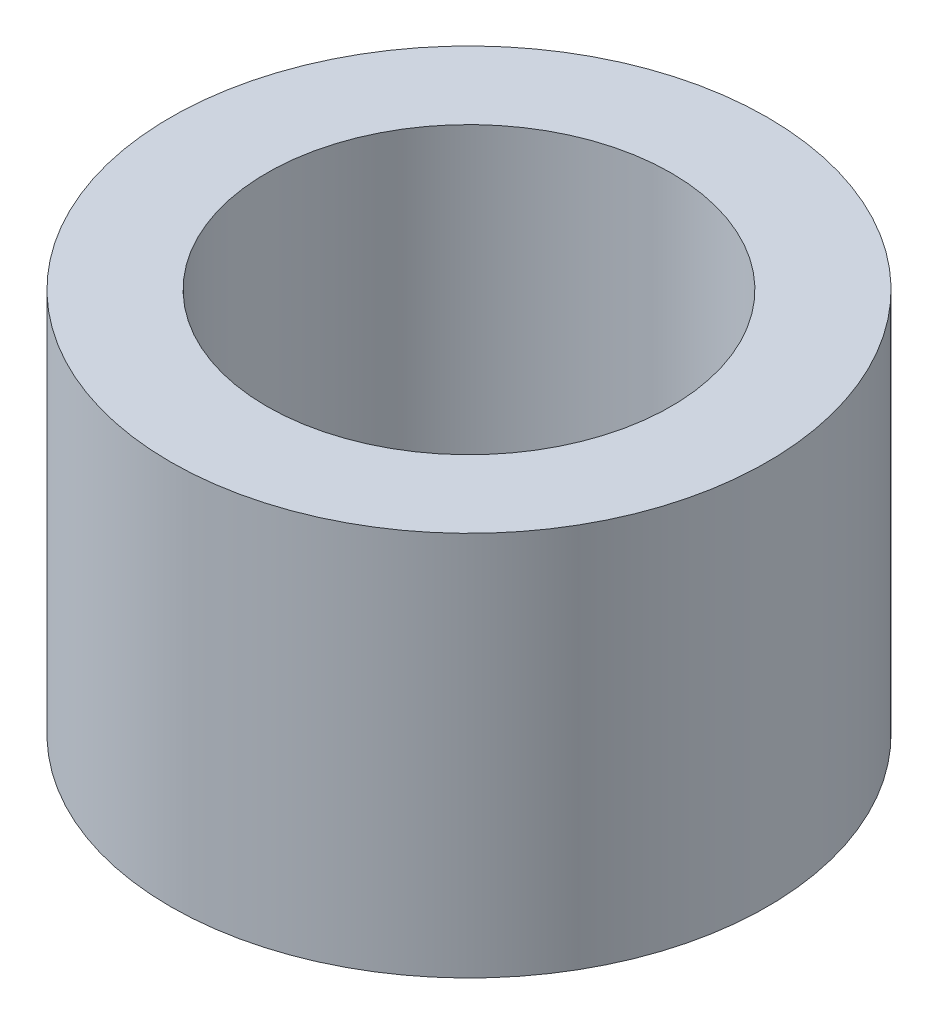
ISO-10303-21;
HEADER;
FILE_DESCRIPTION(('STEP AP214'),'2;1');
FILE_NAME('part.step','',(''),(''),'','','');
FILE_SCHEMA(('AUTOMOTIVE_DESIGN { 1 0 10303 214 1 1 1 1 }'));
ENDSEC;
DATA;
#1=APPLICATION_CONTEXT('core data for automotive mechanical design processes');
#2=APPLICATION_PROTOCOL_DEFINITION('international standard','automotive_design',2000,#1);
#3=PRODUCT_CONTEXT('',#1,'mechanical');
#4=PRODUCT('Part','Part','',(#3));
#5=PRODUCT_RELATED_PRODUCT_CATEGORY('part','',(#4));
#6=PRODUCT_DEFINITION_FORMATION('','',#4);
#7=PRODUCT_DEFINITION_CONTEXT('part definition',#1,'design');
#8=PRODUCT_DEFINITION('design','',#6,#7);
#9=PRODUCT_DEFINITION_SHAPE('','',#8);
#10=(LENGTH_UNIT() NAMED_UNIT(*) SI_UNIT(.MILLI.,.METRE.));
#11=(NAMED_UNIT(*) PLANE_ANGLE_UNIT() SI_UNIT($,.RADIAN.));
#12=(NAMED_UNIT(*) SI_UNIT($,.STERADIAN.) SOLID_ANGLE_UNIT());
#13=UNCERTAINTY_MEASURE_WITH_UNIT(LENGTH_MEASURE(1.E-05),#10,'distance_accuracy_value','');
#14=(GEOMETRIC_REPRESENTATION_CONTEXT(3) GLOBAL_UNCERTAINTY_ASSIGNED_CONTEXT((#13)) GLOBAL_UNIT_ASSIGNED_CONTEXT((#10,
#11,#12)) REPRESENTATION_CONTEXT('',''));
#15=CARTESIAN_POINT('',(0.,0.,0.));
#16=DIRECTION('',(0.,0.,1.));
#17=DIRECTION('',(1.,0.,0.));
#18=AXIS2_PLACEMENT_3D('',#15,#16,#17);
#19=CARTESIAN_POINT('',(0.,5.08,0.));
#20=DIRECTION('',(0.,1.,0.));
#21=DIRECTION('',(0.,0.,1.));
#22=AXIS2_PLACEMENT_3D('',#19,#20,#21);
#23=PLANE('',#22);
#24=CARTESIAN_POINT('',(0.,5.08,0.));
#25=DIRECTION('',(0.,1.,0.));
#26=DIRECTION('',(0.,0.,1.));
#27=AXIS2_PLACEMENT_3D('',#24,#25,#26);
#28=CIRCLE('',#27,3.937);
#29=CARTESIAN_POINT('',(0.,5.08,3.937));
#30=VERTEX_POINT('',#29);
#31=EDGE_CURVE('E10',#30,#30,#28,.T.);
#32=ORIENTED_EDGE('',*,*,#31,.T.);
#33=EDGE_LOOP('',(#32));
#34=FACE_BOUND('',#33,.T.);
#35=CARTESIAN_POINT('',(0.,5.08,0.));
#36=DIRECTION('',(0.,1.,0.));
#37=DIRECTION('',(0.,0.,1.));
#38=AXIS2_PLACEMENT_3D('',#35,#36,#37);
#39=CIRCLE('',#38,2.667);
#40=CARTESIAN_POINT('',(0.,5.08,2.667));
#41=VERTEX_POINT('',#40);
#42=EDGE_CURVE('E43',#41,#41,#39,.T.);
#43=ORIENTED_EDGE('',*,*,#42,.F.);
#44=EDGE_LOOP('',(#43));
#45=FACE_BOUND('',#44,.T.);
#46=ADVANCED_FACE('F32',(#34,#45),#23,.T.);
#47=CARTESIAN_POINT('',(0.,0.,0.));
#48=DIRECTION('',(0.,1.,0.));
#49=DIRECTION('',(0.,0.,1.));
#50=AXIS2_PLACEMENT_3D('',#47,#48,#49);
#51=PLANE('',#50);
#52=CARTESIAN_POINT('',(0.,0.,0.));
#53=DIRECTION('',(0.,1.,0.));
#54=DIRECTION('',(0.,0.,1.));
#55=AXIS2_PLACEMENT_3D('',#52,#53,#54);
#56=CIRCLE('',#55,3.937);
#57=CARTESIAN_POINT('',(0.,0.,3.937));
#58=VERTEX_POINT('',#57);
#59=EDGE_CURVE('E36',#58,#58,#56,.T.);
#60=ORIENTED_EDGE('',*,*,#59,.F.);
#61=EDGE_LOOP('',(#60));
#62=FACE_BOUND('',#61,.T.);
#63=CARTESIAN_POINT('',(0.,0.,0.));
#64=DIRECTION('',(0.,1.,0.));
#65=DIRECTION('',(0.,0.,1.));
#66=AXIS2_PLACEMENT_3D('',#63,#64,#65);
#67=CIRCLE('',#66,2.667);
#68=CARTESIAN_POINT('',(0.,0.,2.667));
#69=VERTEX_POINT('',#68);
#70=EDGE_CURVE('E45',#69,#69,#67,.T.);
#71=ORIENTED_EDGE('',*,*,#70,.T.);
#72=EDGE_LOOP('',(#71));
#73=FACE_BOUND('',#72,.T.);
#74=ADVANCED_FACE('F55',(#62,#73),#51,.F.);
#75=CARTESIAN_POINT('',(0.,5.08,0.));
#76=DIRECTION('',(0.,-1.,0.));
#77=DIRECTION('',(0.,0.,-1.));
#78=AXIS2_PLACEMENT_3D('',#75,#76,#77);
#79=CYLINDRICAL_SURFACE('',#78,3.937);
#80=ORIENTED_EDGE('',*,*,#31,.F.);
#81=EDGE_LOOP('',(#80));
#82=FACE_BOUND('',#81,.T.);
#83=ORIENTED_EDGE('',*,*,#59,.T.);
#84=EDGE_LOOP('',(#83));
#85=FACE_BOUND('',#84,.T.);
#86=ADVANCED_FACE('F34',(#82,#85),#79,.T.);
#87=CARTESIAN_POINT('',(0.,5.08,0.));
#88=DIRECTION('',(0.,-1.,0.));
#89=DIRECTION('',(0.,0.,-1.));
#90=AXIS2_PLACEMENT_3D('',#87,#88,#89);
#91=CYLINDRICAL_SURFACE('',#90,2.667);
#92=ORIENTED_EDGE('',*,*,#42,.T.);
#93=EDGE_LOOP('',(#92));
#94=FACE_BOUND('',#93,.T.);
#95=ORIENTED_EDGE('',*,*,#70,.F.);
#96=EDGE_LOOP('',(#95));
#97=FACE_BOUND('',#96,.T.);
#98=ADVANCED_FACE('F51',(#94,#97),#91,.F.);
#99=CLOSED_SHELL('',(#46,#74,#86,#98));
#100=MANIFOLD_SOLID_BREP('B2',#99);
#101=ADVANCED_BREP_SHAPE_REPRESENTATION('',(#18,#100),#14);
#102=SHAPE_DEFINITION_REPRESENTATION(#9,#101);
ENDSEC;
END-ISO-10303-21;
